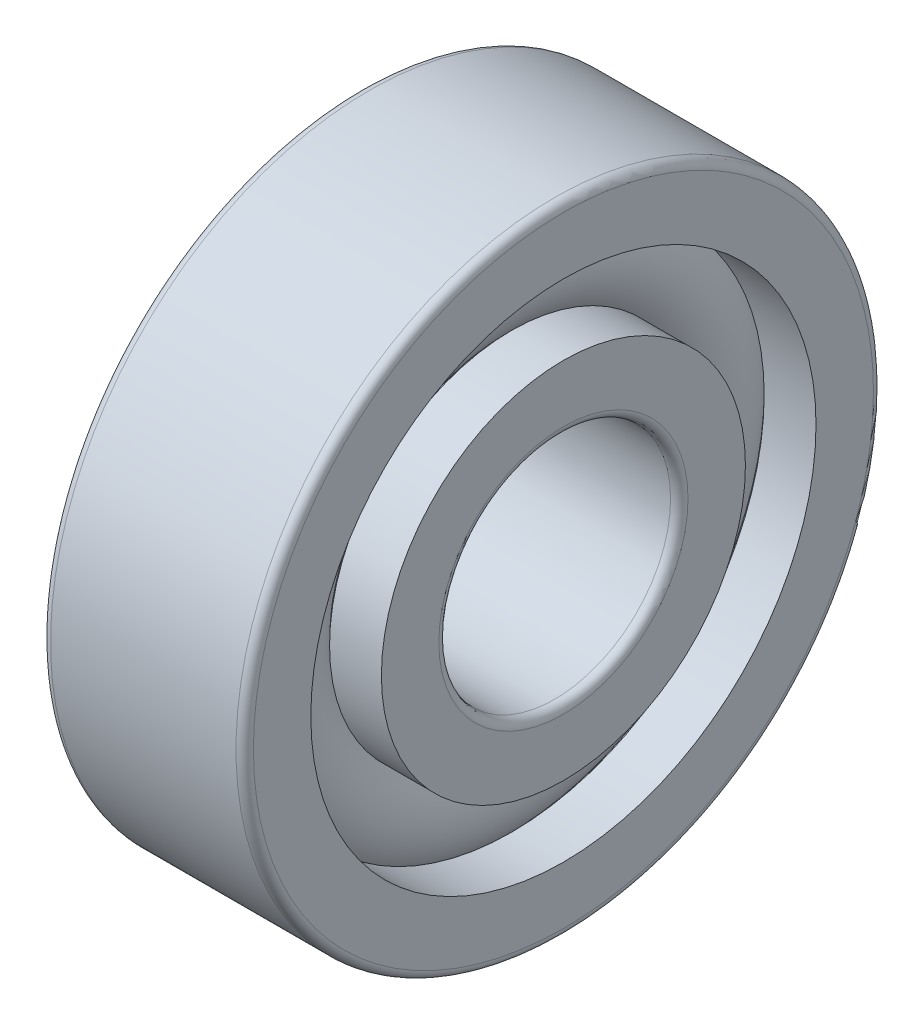
ISO-10303-21;
HEADER;
FILE_DESCRIPTION(('STEP AP214'),'2;1');
FILE_NAME('part.step','',(''),(''),'','','');
FILE_SCHEMA(('AUTOMOTIVE_DESIGN { 1 0 10303 214 1 1 1 1 }'));
ENDSEC;
DATA;
#1=APPLICATION_CONTEXT('core data for automotive mechanical design processes');
#2=APPLICATION_PROTOCOL_DEFINITION('international standard','automotive_design',2000,#1);
#3=PRODUCT_CONTEXT('',#1,'mechanical');
#4=PRODUCT('Part','Part','',(#3));
#5=PRODUCT_RELATED_PRODUCT_CATEGORY('part','',(#4));
#6=PRODUCT_DEFINITION_FORMATION('','',#4);
#7=PRODUCT_DEFINITION_CONTEXT('part definition',#1,'design');
#8=PRODUCT_DEFINITION('design','',#6,#7);
#9=PRODUCT_DEFINITION_SHAPE('','',#8);
#10=(LENGTH_UNIT() NAMED_UNIT(*) SI_UNIT(.MILLI.,.METRE.));
#11=(NAMED_UNIT(*) PLANE_ANGLE_UNIT() SI_UNIT($,.RADIAN.));
#12=(NAMED_UNIT(*) SI_UNIT($,.STERADIAN.) SOLID_ANGLE_UNIT());
#13=UNCERTAINTY_MEASURE_WITH_UNIT(LENGTH_MEASURE(1.E-05),#10,'distance_accuracy_value','');
#14=(GEOMETRIC_REPRESENTATION_CONTEXT(3) GLOBAL_UNCERTAINTY_ASSIGNED_CONTEXT((#13)) GLOBAL_UNIT_ASSIGNED_CONTEXT((#10,
#11,#12)) REPRESENTATION_CONTEXT('',''));
#15=CARTESIAN_POINT('',(0.,0.,0.));
#16=DIRECTION('',(0.,0.,1.));
#17=DIRECTION('',(1.,0.,0.));
#18=AXIS2_PLACEMENT_3D('',#15,#16,#17);
#19=CARTESIAN_POINT('',(3.5,0.,0.));
#20=DIRECTION('',(1.,0.,0.));
#21=DIRECTION('',(0.,0.,-1.));
#22=AXIS2_PLACEMENT_3D('',#19,#20,#21);
#23=TOROIDAL_SURFACE('',#22,7.5,2.079);
#24=CARTESIAN_POINT('',(3.5,0.,-9.579));
#25=VERTEX_POINT('',#24);
#26=VERTEX_LOOP('',#25);
#27=FACE_BOUND('',#26,.T.);
#28=ADVANCED_FACE('P0_F14',(#27),#23,.T.);
#29=CLOSED_SHELL('',(#28));
#30=CARTESIAN_POINT('',(3.5,0.,0.));
#31=DIRECTION('',(1.,0.,0.));
#32=DIRECTION('',(0.,0.,-1.));
#33=AXIS2_PLACEMENT_3D('',#30,#31,#32);
#34=TOROIDAL_SURFACE('',#33,7.5,2.03742);
#35=CARTESIAN_POINT('',(3.5,0.,-9.53742));
#36=VERTEX_POINT('',#35);
#37=VERTEX_LOOP('',#36);
#38=FACE_BOUND('',#37,.T.);
#39=ADVANCED_FACE('P0_F16',(#38),#34,.F.);
#40=CLOSED_SHELL('',(#39));
#41=ORIENTED_CLOSED_SHELL('',*,#40,.T.);
#42=BREP_WITH_VOIDS('P0_B1',#29,(#41));
#43=CARTESIAN_POINT('',(3.5,0.,0.));
#44=DIRECTION('',(-1.,0.,0.));
#45=DIRECTION('',(0.,0.,1.));
#46=AXIS2_PLACEMENT_3D('',#43,#44,#45);
#47=TOROIDAL_SURFACE('',#46,7.49999999999999,2.10000000000001);
#48=CARTESIAN_POINT('',(1.789305404229,0.,0.));
#49=DIRECTION('',(-1.,0.,0.));
#50=DIRECTION('',(0.,0.,1.));
#51=AXIS2_PLACEMENT_3D('',#48,#49,#50);
#52=CIRCLE('',#51,8.718);
#53=CARTESIAN_POINT('',(1.789305404229,0.,8.718));
#54=VERTEX_POINT('',#53);
#55=EDGE_CURVE('P1_E66',#54,#54,#52,.T.);
#56=ORIENTED_EDGE('',*,*,#55,.T.);
#57=EDGE_LOOP('',(#56));
#58=FACE_BOUND('',#57,.T.);
#59=CARTESIAN_POINT('',(5.210694595771,0.,0.));
#60=DIRECTION('',(-1.,0.,0.));
#61=DIRECTION('',(0.,0.,1.));
#62=AXIS2_PLACEMENT_3D('',#59,#60,#61);
#63=CIRCLE('',#62,8.718);
#64=CARTESIAN_POINT('',(5.210694595771,0.,8.718));
#65=VERTEX_POINT('',#64);
#66=EDGE_CURVE('P1_E62',#65,#65,#63,.F.);
#67=ORIENTED_EDGE('',*,*,#66,.T.);
#68=EDGE_LOOP('',(#67));
#69=FACE_BOUND('',#68,.T.);
#70=ADVANCED_FACE('P1_F17',(#58,#69),#47,.F.);
#71=CARTESIAN_POINT('',(7.35,0.,0.));
#72=DIRECTION('',(-1.,0.,0.));
#73=DIRECTION('',(0.,0.,1.));
#74=AXIS2_PLACEMENT_3D('',#71,#72,#73);
#75=CYLINDRICAL_SURFACE('',#74,8.718);
#76=ORIENTED_EDGE('',*,*,#55,.F.);
#77=EDGE_LOOP('',(#76));
#78=FACE_BOUND('',#77,.T.);
#79=CARTESIAN_POINT('',(0.,0.,0.));
#80=DIRECTION('',(-1.,0.,0.));
#81=DIRECTION('',(0.,0.,1.));
#82=AXIS2_PLACEMENT_3D('',#79,#80,#81);
#83=CIRCLE('',#82,8.718);
#84=CARTESIAN_POINT('',(0.,0.,8.718));
#85=VERTEX_POINT('',#84);
#86=EDGE_CURVE('P1_E22',#85,#85,#83,.T.);
#87=ORIENTED_EDGE('',*,*,#86,.T.);
#88=EDGE_LOOP('',(#87));
#89=FACE_BOUND('',#88,.T.);
#90=ADVANCED_FACE('P1_F107',(#78,#89),#75,.F.);
#91=CARTESIAN_POINT('',(7.35,0.,0.));
#92=DIRECTION('',(-1.,0.,0.));
#93=DIRECTION('',(0.,0.,1.));
#94=AXIS2_PLACEMENT_3D('',#91,#92,#93);
#95=CYLINDRICAL_SURFACE('',#94,8.718);
#96=ORIENTED_EDGE('',*,*,#66,.F.);
#97=EDGE_LOOP('',(#96));
#98=FACE_BOUND('',#97,.T.);
#99=CARTESIAN_POINT('',(7.,0.,0.));
#100=DIRECTION('',(-1.,0.,0.));
#101=DIRECTION('',(0.,0.,1.));
#102=AXIS2_PLACEMENT_3D('',#99,#100,#101);
#103=CIRCLE('',#102,8.718);
#104=CARTESIAN_POINT('',(7.,0.,8.718));
#105=VERTEX_POINT('',#104);
#106=EDGE_CURVE('P1_E50',#105,#105,#103,.T.);
#107=ORIENTED_EDGE('',*,*,#106,.F.);
#108=EDGE_LOOP('',(#107));
#109=FACE_BOUND('',#108,.T.);
#110=ADVANCED_FACE('P1_F105',(#98,#109),#95,.F.);
#111=CARTESIAN_POINT('',(0.,0.,0.));
#112=DIRECTION('',(1.,0.,0.));
#113=DIRECTION('',(0.,0.,-1.));
#114=AXIS2_PLACEMENT_3D('',#111,#112,#113);
#115=PLANE('',#114);
#116=CARTESIAN_POINT('',(0.,0.,0.));
#117=DIRECTION('',(1.,0.,0.));
#118=DIRECTION('',(0.,0.,-1.));
#119=AXIS2_PLACEMENT_3D('',#116,#117,#118);
#120=CIRCLE('',#119,10.7);
#121=CARTESIAN_POINT('',(0.,10.7,0.));
#122=VERTEX_POINT('',#121);
#123=CARTESIAN_POINT('',(0.,-10.7,0.));
#124=VERTEX_POINT('',#123);
#125=EDGE_CURVE('P1_E49',#122,#124,#120,.T.);
#126=ORIENTED_EDGE('',*,*,#125,.F.);
#127=CARTESIAN_POINT('',(0.,-10.7,0.));
#128=CARTESIAN_POINT('',(4.28441808046526E-08,-10.7000206018002,-0.155731176972266));
#129=CARTESIAN_POINT('',(1.87142527797702E-08,-10.6966262554764,-0.311448028479002));
#130=CARTESIAN_POINT('',(-1.0594548809439E-08,-10.6830796687314,-0.62257498520896));
#131=CARTESIAN_POINT('',(-1.57749952226646E-08,-10.6729279892665,-0.77798511482054));
#132=CARTESIAN_POINT('',(1.65838766574135E-07,-10.6425671899318,-1.12700464790973));
#133=CARTESIAN_POINT('',(4.00919694880424E-07,-10.6204789767699,-1.32045697080125));
#134=CARTESIAN_POINT('',(4.7297387966872E-07,-10.5823698603869,-1.58763922626179));
#135=CARTESIAN_POINT('',(4.65667907296704E-07,-10.5709329936371,-1.66204753314343));
#136=CARTESIAN_POINT('',(3.81191217555367E-07,-10.5299190216942,-1.91111049487476));
#137=CARTESIAN_POINT('',(2.22867376829379E-07,-10.4967347334802,-2.08518492880584));
#138=CARTESIAN_POINT('',(2.5371208492992E-08,-10.4168431729079,-2.45421840747267));
#139=CARTESIAN_POINT('',(4.57442003013319E-09,-10.3689323749512,-2.64891838191987));
#140=CARTESIAN_POINT('',(-2.99117349499777E-10,-10.3014869539373,-2.89351191082808));
#141=CARTESIAN_POINT('',(-1.23401851757406E-10,-10.2869325265207,-2.94481077879291));
#142=CARTESIAN_POINT('',(2.28383579196267E-10,-10.2443639354108,-3.09073739233532));
#143=CARTESIAN_POINT('',(2.77582641951076E-10,-10.2154328061479,-3.18509922270567));
#144=CARTESIAN_POINT('',(9.6209794425469E-10,-10.1247297847092,-3.46692231983001));
#145=CARTESIAN_POINT('',(2.13424093035944E-09,-10.0590435725525,-3.65313910283581));
#146=CARTESIAN_POINT('',(4.18786867869721E-09,-9.91747780198171,-4.02164569479922));
#147=CARTESIAN_POINT('',(5.06935288904928E-09,-9.84159822421365,-4.20393549629995));
#148=CARTESIAN_POINT('',(6.16994990779825E-09,-9.67986653455491,-4.56403942561848));
#149=CARTESIAN_POINT('',(6.38906217720119E-09,-9.59401441454931,-4.74185354979415));
#150=CARTESIAN_POINT('',(6.00226867524165E-09,-9.41260326769843,-5.09245900211604));
#151=CARTESIAN_POINT('',(5.39636312766041E-09,-9.31704424348611,-5.26525033162464));
#152=CARTESIAN_POINT('',(3.7074729994729E-09,-9.11651384216293,-5.60527908534792));
#153=CARTESIAN_POINT('',(2.62448906589219E-09,-9.01154247781749,-5.77251651709461));
#154=CARTESIAN_POINT('',(7.75402176902388E-10,-8.79249997465785,-6.10093311456806));
#155=CARTESIAN_POINT('',(9.29844792972276E-12,-8.67842885805866,-6.26211229508327));
#156=CARTESIAN_POINT('',(-5.41962392509637E-12,-8.49097234727286,-6.5120267056825));
#157=CARTESIAN_POINT('',(2.46268533806897E-10,-8.42046424848683,-6.60293520549551));
#158=CARTESIAN_POINT('',(5.75923549512679E-10,-8.27655548806601,-6.7824369425381));
#159=CARTESIAN_POINT('',(6.53890810834709E-10,-8.20315483314759,-6.8710301851428));
#160=CARTESIAN_POINT('',(5.27541708993272E-10,-8.05353812757376,-7.04580575017888));
#161=CARTESIAN_POINT('',(3.23225668870321E-10,-7.97732208014034,-7.13198807536916));
#162=CARTESIAN_POINT('',(-3.10133483402655E-11,-7.8221543668481,-7.30185211143674));
#163=CARTESIAN_POINT('',(-1.80936323629981E-10,-7.74320270089886,-7.38553382223137));
#164=CARTESIAN_POINT('',(8.07105944282768E-10,-7.56658717515005,-7.56679147119302));
#165=CARTESIAN_POINT('',(2.20861726734696E-09,-7.46833867131716,-7.6637994000972));
#166=CARTESIAN_POINT('',(7.30451139097094E-09,-7.29674062417253,-7.82679652854347));
#167=CARTESIAN_POINT('',(1.02301675790849E-08,-7.22428941959495,-7.89373542536834));
#168=CARTESIAN_POINT('',(1.66458006045726E-08,-7.05921845538704,-8.04206384375352));
#169=CARTESIAN_POINT('',(2.00940219232187E-08,-6.96608443863842,-8.1228827178692));
#170=CARTESIAN_POINT('',(2.57321124190968E-08,-6.77707735370394,-8.28124910023368));
#171=CARTESIAN_POINT('',(2.79219801904137E-08,-6.68120428245796,-8.35879660482739));
#172=CARTESIAN_POINT('',(3.02786308253107E-08,-6.48683219980679,-8.51052840233793));
#173=CARTESIAN_POINT('',(3.04454140294875E-08,-6.38833318884369,-8.58471269582098));
#174=CARTESIAN_POINT('',(2.87413285463309E-08,-6.1888278264495,-8.72962896691505));
#175=CARTESIAN_POINT('',(2.68704628216802E-08,-6.08782147866421,-8.80036094954547));
#176=CARTESIAN_POINT('',(2.16070432045351E-08,-5.88342219666097,-8.93828747390142));
#177=CARTESIAN_POINT('',(1.82144934808465E-08,-5.78002926898202,-9.00548202531752));
#178=CARTESIAN_POINT('',(1.13442273908092E-08,-5.57098154155768,-9.13625478230249));
#179=CARTESIAN_POINT('',(7.86651136732852E-09,-5.46532675091846,-9.1998330024268));
#180=CARTESIAN_POINT('',(1.84253996238561E-09,-5.25187920799096,-9.32329082272622));
#181=CARTESIAN_POINT('',(-7.037203658108E-10,-5.14408646706003,-9.3831704425423));
#182=CARTESIAN_POINT('',(7.55485859161508E-10,-4.91849904771522,-9.50344939822193));
#183=CARTESIAN_POINT('',(5.25667259766032E-09,-4.80055189882832,-9.56356295477433));
#184=CARTESIAN_POINT('',(-4.71932937912747E-09,-4.54765146590607,-9.68662713030768));
#185=CARTESIAN_POINT('',(-2.16372887797224E-08,-4.41241418712923,-9.74899423358394));
#186=CARTESIAN_POINT('',(3.95346380274403E-08,-4.1394932084926,-9.86811952950824));
#187=CARTESIAN_POINT('',(1.17618799389252E-07,-4.00180965653835,-9.92487805990711));
#188=CARTESIAN_POINT('',(1.4185262965768E-07,-3.7995915068126,-10.0032020879936));
#189=CARTESIAN_POINT('',(1.36638636645166E-07,-3.73596362574171,-10.0271315601937));
#190=CARTESIAN_POINT('',(1.05314960998661E-07,-3.53425253691591,-10.1007879200659));
#191=CARTESIAN_POINT('',(6.19915618061382E-08,-3.39534133609991,-10.1482717917067));
#192=CARTESIAN_POINT('',(1.35169974258519E-08,-3.1301795742953,-10.2328636780714));
#193=CARTESIAN_POINT('',(4.87553603483086E-09,-3.00410865345899,-10.27053700085));
#194=CARTESIAN_POINT('',(-2.23306103426926E-10,-2.79646816088441,-10.3284625964253));
#195=CARTESIAN_POINT('',(4.49635863120921E-11,-2.71527943697002,-10.3500908477888));
#196=CARTESIAN_POINT('',(-9.12742229559626E-11,-2.46853965529237,-10.4127455696213));
#197=CARTESIAN_POINT('',(-1.47330340042728E-09,-2.30222539007775,-10.4508077410585));
#198=CARTESIAN_POINT('',(1.46830266961542E-08,-1.96797292791342,-10.5189513182928));
#199=CARTESIAN_POINT('',(3.22207045317412E-08,-1.80003478966728,-10.5490330114771));
#200=CARTESIAN_POINT('',(7.8443289729365E-08,-1.58092722262813,-10.5829086785099));
#201=CARTESIAN_POINT('',(9.07323842570242E-08,-1.53030703145438,-10.5903643409726));
#202=CARTESIAN_POINT('',(1.31216688704994E-07,-1.42896574212683,-10.6045594181134));
#203=CARTESIAN_POINT('',(1.59411770760216E-07,-1.37824464478747,-10.6112988385489));
#204=CARTESIAN_POINT('',(1.90287983013437E-07,-1.25365163147976,-10.6269074626864));
#205=CARTESIAN_POINT('',(1.75567219029717E-07,-1.17972685681932,-10.63535393116));
#206=CARTESIAN_POINT('',(1.23032866982224E-07,-0.959548137339615,-10.6581747291847));
#207=CARTESIAN_POINT('',(7.66982392883451E-08,-0.813054868855301,-10.6702982895757));
#208=CARTESIAN_POINT('',(1.98947863215445E-08,-0.530818826904349,-10.6878079063488));
#209=CARTESIAN_POINT('',(6.97300082432535E-09,-0.395103083842745,-10.6936351021162));
#210=CARTESIAN_POINT('',(-6.14716068628117E-10,-0.172902763827355,-10.6989690831685));
#211=CARTESIAN_POINT('',(-2.08720576967204E-10,-0.0864520435853254,-10.7000032489343));
#212=CARTESIAN_POINT('',(2.60114755355551E-10,0.10773945706165,-10.6999959510683));
#213=CARTESIAN_POINT('',(2.13842140104958E-10,0.215480969405964,-10.6983806947826));
#214=CARTESIAN_POINT('',(6.1838762035112E-10,0.430864935906395,-10.6918878759992));
#215=CARTESIAN_POINT('',(1.0692064354725E-09,0.538507389918882,-10.6870103087789));
#216=CARTESIAN_POINT('',(2.13044578322995E-09,0.753596345694182,-10.674008393873));
#217=CARTESIAN_POINT('',(2.74086653767381E-09,0.861042847184459,-10.6658840416753));
#218=CARTESIAN_POINT('',(4.17326123935631E-09,1.0756414818028,-10.6463929921846));
#219=CARTESIAN_POINT('',(4.99523546835203E-09,1.18279361453862,-10.6350262905734));
#220=CARTESIAN_POINT('',(6.79996081865877E-09,1.39670581961932,-10.6090617027169));
#221=CARTESIAN_POINT('',(7.7827121447896E-09,1.50346589146456,-10.5944638123553));
#222=CARTESIAN_POINT('',(9.88736417346212E-09,1.71649651821774,-10.5620499476376));
#223=CARTESIAN_POINT('',(1.10092650452133E-08,1.82276707253025,-10.5442339693682));
#224=CARTESIAN_POINT('',(1.33644009719797E-08,2.03472168693261,-10.5054002370902));
#225=CARTESIAN_POINT('',(1.45976361559328E-08,2.14040574634308,-10.4843824793735));
#226=CARTESIAN_POINT('',(1.71509063277592E-08,2.35109091995982,-10.4391643463807));
#227=CARTESIAN_POINT('',(1.847094141113E-08,2.45609203341457,-10.4149639676031));
#228=CARTESIAN_POINT('',(2.11740207059922E-08,2.66531548960273,-10.3634026749677));
#229=CARTESIAN_POINT('',(2.25570649831574E-08,2.76953783152431,-10.3360417578158));
#230=CARTESIAN_POINT('',(2.5363795411047E-08,2.97710862908959,-10.2781843504466));
#231=CARTESIAN_POINT('',(2.67874816017782E-08,3.08045708387294,-10.2476878571427));
#232=CARTESIAN_POINT('',(2.96543701601672E-08,3.28618578919038,-10.1835871228348));
#233=CARTESIAN_POINT('',(3.10975725459055E-08,3.38856603882735,-10.1499828789515));
#234=CARTESIAN_POINT('',(3.3983657741908E-08,3.59226489935056,-10.079697305039));
#235=CARTESIAN_POINT('',(3.54265405518935E-08,3.6935835093146,-10.043015972337));
#236=CARTESIAN_POINT('',(3.82934281321512E-08,3.89506662480983,-9.96660969102037));
#237=CARTESIAN_POINT('',(3.97174328871184E-08,3.99523112940533,-9.92688473993826));
#238=CARTESIAN_POINT('',(4.25292863962838E-08,4.19431462169321,-9.84442747009861));
#239=CARTESIAN_POINT('',(4.39171351232639E-08,4.29323360844792,-9.80169514907721));
#240=CARTESIAN_POINT('',(4.66406782653968E-08,4.48973578924632,-9.71326213255053));
#241=CARTESIAN_POINT('',(4.79763726443084E-08,4.58731898236175,-9.66756143498262));
#242=CARTESIAN_POINT('',(5.05808887367166E-08,4.78106051914386,-9.57323336790934));
#243=CARTESIAN_POINT('',(5.18497104076169E-08,4.87721886190292,-9.5246059965398));
#244=CARTESIAN_POINT('',(5.43070425293543E-08,5.06802294160104,-9.42446895570336));
#245=CARTESIAN_POINT('',(5.54955529336858E-08,5.16266867766419,-9.37295928456745));
#246=CARTESIAN_POINT('',(5.77801038777202E-08,5.35036116807463,-9.26710464882882));
#247=CARTESIAN_POINT('',(5.88761443692318E-08,5.44340792158858,-9.2127596827485));
#248=CARTESIAN_POINT('',(6.09648766852753E-08,5.62781753032898,-9.10128404963791));
#249=CARTESIAN_POINT('',(6.19575684619311E-08,5.71918038477534,-9.0441533813172));
#250=CARTESIAN_POINT('',(6.38300043329516E-08,5.90013881564959,-8.9271584788619));
#251=CARTESIAN_POINT('',(6.47097483815339E-08,5.98973439136112,-8.86729424361931));
#252=CARTESIAN_POINT('',(6.63479697496178E-08,6.16707649798912,-8.74488683748722));
#253=CARTESIAN_POINT('',(6.7106447026987E-08,6.25482302826315,-8.68234366566698));
#254=CARTESIAN_POINT('',(6.84950956470571E-08,6.42838696483495,-8.55463546171116));
#255=CARTESIAN_POINT('',(6.91252669526097E-08,6.51420437057418,-8.48947042881649));
#256=CARTESIAN_POINT('',(7.02515441601112E-08,6.68383173959111,-8.3565779711094));
#257=CARTESIAN_POINT('',(7.07476500310075E-08,6.76764170240383,-8.28885054570349));
#258=CARTESIAN_POINT('',(7.16013169669254E-08,6.93317769927142,-8.15089511015412));
#259=CARTESIAN_POINT('',(7.19588780078794E-08,7.01490373296428,-8.08066709957628));
#260=CARTESIAN_POINT('',(7.25322554930837E-08,7.1761972873053,-7.93777458322724));
#261=CARTESIAN_POINT('',(7.27480719209182E-08,7.25576480770347,-7.86511007717387));
#262=CARTESIAN_POINT('',(7.30360405169255E-08,7.41266872126167,-7.71741088327961));
#263=CARTESIAN_POINT('',(7.31081926767792E-08,7.4900051142925,-7.64237619530147));
#264=CARTESIAN_POINT('',(7.310819267678E-08,7.64237619530147,-7.4900051142925));
#265=CARTESIAN_POINT('',(7.3036040516927E-08,7.71741088327961,-7.41266872126167));
#266=CARTESIAN_POINT('',(7.27480719209167E-08,7.86511007717386,-7.25576480770347));
#267=CARTESIAN_POINT('',(7.25322554930782E-08,7.93777458322723,-7.1761972873053));
#268=CARTESIAN_POINT('',(7.19588780078848E-08,8.08066709957627,-7.01490373296429));
#269=CARTESIAN_POINT('',(7.16013169669456E-08,8.15089511015412,-6.93317769927143));
#270=CARTESIAN_POINT('',(7.07476500309874E-08,8.28885054570348,-6.76764170240383));
#271=CARTESIAN_POINT('',(7.02515441600363E-08,8.3565779711094,-6.68383173959111));
#272=CARTESIAN_POINT('',(6.91252669526846E-08,8.48947042881648,-6.51420437057419));
#273=CARTESIAN_POINT('',(6.84950956473368E-08,8.55463546171115,-6.42838696483496));
#274=CARTESIAN_POINT('',(6.71064470267073E-08,8.68234366566697,-6.25482302826316));
#275=CARTESIAN_POINT('',(6.6347969748574E-08,8.74488683748721,-6.16707649798913));
#276=CARTESIAN_POINT('',(6.47097483825777E-08,8.86729424361931,-5.98973439136113));
#277=CARTESIAN_POINT('',(6.38300043368473E-08,8.9271584788619,-5.9001388156496));
#278=CARTESIAN_POINT('',(6.19575684580354E-08,9.0441533813172,-5.71918038477534));
#279=CARTESIAN_POINT('',(6.09648766707366E-08,9.10128404963791,-5.62781753032899));
#280=CARTESIAN_POINT('',(5.88761443837705E-08,9.2127596827485,-5.44340792158859));
#281=CARTESIAN_POINT('',(5.77801039319795E-08,9.26710464882882,-5.35036116807463));
#282=CARTESIAN_POINT('',(5.54955529878467E-08,9.37295928456745,-5.16266867766419));
#283=CARTESIAN_POINT('',(5.43070425436963E-08,9.42446895570336,-5.06802294160105));
#284=CARTESIAN_POINT('',(5.18497103932749E-08,9.52460599653979,-4.87721886190292));
#285=CARTESIAN_POINT('',(5.05808887335093E-08,9.57323336790931,-4.78106051914386));
#286=CARTESIAN_POINT('',(4.79763726475157E-08,9.66756143498264,-4.58731898236176));
#287=CARTESIAN_POINT('',(4.66406782638839E-08,9.71326213255062,-4.48973578924633));
#288=CARTESIAN_POINT('',(4.39171351247768E-08,9.80169514907711,-4.29323360844791));
#289=CARTESIAN_POINT('',(4.25292864055427E-08,9.84442747009824,-4.19431462169317));
#290=CARTESIAN_POINT('',(3.97174328778595E-08,9.92688473993862,-3.99523112940538));
#291=CARTESIAN_POINT('',(3.82934280966286E-08,9.96660969102173,-3.89506662480999));
#292=CARTESIAN_POINT('',(3.5426540587416E-08,10.0430159723357,-3.69358350931445));
#293=CARTESIAN_POINT('',(3.39836578747393E-08,10.0796973050339,-3.59226489934998));
#294=CARTESIAN_POINT('',(3.10975724130742E-08,10.1499828789566,-3.38856603882795));
#295=CARTESIAN_POINT('',(2.96543696643649E-08,10.1835871228538,-3.2861857891926));
#296=CARTESIAN_POINT('',(2.67874820975798E-08,10.2476878571237,-3.08045708387074));
#297=CARTESIAN_POINT('',(2.53637972614219E-08,10.2781843503757,-2.97710862908137));
#298=CARTESIAN_POINT('',(2.25570631327843E-08,10.3360417578866,-2.76953783153255));
#299=CARTESIAN_POINT('',(2.1174013800304E-08,10.3634026752322,-2.66531548963346));
#300=CARTESIAN_POINT('',(1.84709483168111E-08,10.4149639673386,-2.45609203338386));
#301=CARTESIAN_POINT('',(1.71509321000996E-08,10.4391643453938,-2.3510909198452));
#302=CARTESIAN_POINT('',(1.45976103836206E-08,10.4843824803604,-2.14040574645772));
#303=CARTESIAN_POINT('',(1.33643047884538E-08,10.5054002407735,-2.03472168736043));
#304=CARTESIAN_POINT('',(1.10093612286278E-08,10.5442339656849,-1.82276707210244));
#305=CARTESIAN_POINT('',(9.88772313464474E-09,10.5620499338913,-1.71649651662111));
#306=CARTESIAN_POINT('',(7.78235318404352E-09,10.5944638261017,-1.50346589306121));
#307=CARTESIAN_POINT('',(6.79862115972797E-09,10.609061754019,-1.39670582557805));
#308=CARTESIAN_POINT('',(4.99657512557615E-09,10.6350262392714,-1.18279360857992));
#309=CARTESIAN_POINT('',(4.17826090500806E-09,10.646392800723,-1.07564145956461));
#310=CARTESIAN_POINT('',(2.73586687868084E-09,10.6658842331366,-0.861042869422646));
#311=CARTESIAN_POINT('',(2.11178681423147E-09,10.674009108416,-0.753596428688137));
#312=CARTESIAN_POINT('',(1.08786537853951E-09,10.6870095942369,-0.538507306925046));
#313=CARTESIAN_POINT('',(6.88023695659781E-10,10.6918852092942,-0.4308646261694));
#314=CARTESIAN_POINT('',(1.4420616560637E-10,10.6983833614838,-0.21548127914252));
#315=CARTESIAN_POINT('',(2.29948024144996E-13,10.7000059033255,-0.107740613013363));
#316=CARTESIAN_POINT('',(0.,10.7,0.));
#317=B_SPLINE_CURVE_WITH_KNOTS('',3,(#127,#128,#129,#130,#131,#132,#133,#134,#135,#136,#137,
#138,#139,#140,#141,#142,#143,#144,#145,#146,#147,#148,#149,#150,#151,#152,#153,#154,#155,#156,
#157,#158,#159,#160,#161,#162,#163,#164,#165,#166,#167,#168,#169,#170,#171,#172,#173,#174,#175,
#176,#177,#178,#179,#180,#181,#182,#183,#184,#185,#186,#187,#188,#189,#190,#191,#192,#193,#194,
#195,#196,#197,#198,#199,#200,#201,#202,#203,#204,#205,#206,#207,#208,#209,#210,#211,#212,#213,
#214,#215,#216,#217,#218,#219,#220,#221,#222,#223,#224,#225,#226,#227,#228,#229,#230,#231,#232,
#233,#234,#235,#236,#237,#238,#239,#240,#241,#242,#243,#244,#245,#246,#247,#248,#249,#250,#251,
#252,#253,#254,#255,#256,#257,#258,#259,#260,#261,#262,#263,#264,#265,#266,#267,#268,#269,#270,
#271,#272,#273,#274,#275,#276,#277,#278,#279,#280,#281,#282,#283,#284,#285,#286,#287,#288,#289,
#290,#291,#292,#293,#294,#295,#296,#297,#298,#299,#300,#301,#302,#303,#304,#305,#306,#307,#308,
#309,#310,#311,#312,#313,#314,#315,#316),.UNSPECIFIED.,.F.,.F.,(4,2,2,2,2,2,2,2,2,2,2,2,2,2,2,2,
2,2,2,2,2,2,2,2,2,2,2,2,2,2,2,2,2,2,2,2,2,2,2,2,2,2,2,2,2,2,2,2,2,2,2,2,2,2,2,2,2,2,2,2,2,2,2,2,
2,2,2,2,2,2,2,2,2,2,2,2,2,2,2,2,2,2,2,2,2,2,2,2,2,2,2,2,2,2,4),(0.,0.467128190266816,
0.934217606980419,1.51800562494488,1.74384181807088,2.27523664429593,2.87640854247644,
3.03637646690334,3.33243379421038,3.92449298758778,4.51655330511602,5.10861410442319,
5.70067474313739,6.2927345788867,6.88479296929921,7.22988116517918,7.57496855982647,
7.92005555956156,8.26514257070322,8.67923969169643,8.97512891757365,9.34498457767355,
9.71484065099963,10.0846966620586,10.4545521353583,10.8244065954081,11.1942595667185,
11.5641105738014,11.9611676689896,12.4078202179716,12.8544458529186,13.0583741308201,
13.4986430154732,13.8932903760364,14.1453331974768,14.6569706348937,15.1685896450807,
15.3220855229196,15.4755801668531,15.698782705772,16.1396290932993,16.5470508489084,
16.8063998627716,17.1296093646443,17.4528193344185,17.7760297533781,18.0992406028071,
18.4224518639894,18.7456635182089,19.0688755467496,19.3920879308955,19.7153006519303,
20.0385136911382,20.361727029803,20.6849406492086,21.0081545306391,21.3313686553783,
21.6545830047102,21.9777975599187,22.3010123022877,22.6242272131013,22.9474422736433,
23.2706574651977,23.5938727690485,23.9170881664795,24.2403036387747,24.5635191672181,
24.8867347330936,25.2099503176852,25.5331659022768,25.8563814681523,26.1795969965957,
26.5028124688909,26.826027866322,27.1492431701727,27.4724583617271,27.7956734222691,
28.1188883330827,28.4421030754518,28.7653176306603,29.0885319799921,29.4117461047313,
29.7349599861618,30.0581736055674,30.3813869442322,30.7045999834401,31.027812704475,
31.3510250886208,31.6742371171615,31.997448771381,32.3206600325633,32.6438708819923,
32.9670813009519,33.2902912707261,33.6135007725988),.UNSPECIFIED.);
#318=EDGE_CURVE('P1_E44',#124,#122,#317,.T.);
#319=ORIENTED_EDGE('',*,*,#318,.F.);
#320=EDGE_LOOP('',(#126,#319));
#321=FACE_BOUND('',#320,.T.);
#322=ORIENTED_EDGE('',*,*,#86,.F.);
#323=EDGE_LOOP('',(#322));
#324=FACE_BOUND('',#323,.T.);
#325=ADVANCED_FACE('P1_F52',(#321,#324),#115,.F.);
#326=CARTESIAN_POINT('',(7.,0.,0.));
#327=DIRECTION('',(1.,0.,0.));
#328=DIRECTION('',(0.,0.,-1.));
#329=AXIS2_PLACEMENT_3D('',#326,#327,#328);
#330=PLANE('',#329);
#331=CARTESIAN_POINT('',(7.,10.7,0.));
#332=CARTESIAN_POINT('',(6.99999999972549,10.7000000401248,-0.084372134798505));
#333=CARTESIAN_POINT('',(7.00000000014187,10.6990072672185,-0.168744303065392));
#334=CARTESIAN_POINT('',(6.99999999902096,10.6950371592309,-0.337437133297454));
#335=CARTESIAN_POINT('',(6.99999999748378,10.6920599370188,-0.421757797918997));
#336=CARTESIAN_POINT('',(6.99999998912123,10.6841222080076,-0.590301112895944));
#337=CARTESIAN_POINT('',(6.99999998229615,10.6791618081118,-0.674523768289148));
#338=CARTESIAN_POINT('',(6.99999994989138,10.6672632239962,-0.842825133156855));
#339=CARTESIAN_POINT('',(6.99999992431265,10.6603251405053,-0.926903849743201));
#340=CARTESIAN_POINT('',(6.99999986136537,10.6444662975783,-1.09486948734367));
#341=CARTESIAN_POINT('',(6.99999982399739,10.6355456332266,-1.17875641736099));
#342=CARTESIAN_POINT('',(6.99999965275582,10.6157605403429,-1.34629827961565));
#343=CARTESIAN_POINT('',(6.99999951888657,10.6048961992511,-1.42995322211753));
#344=CARTESIAN_POINT('',(6.99999942201436,10.5861250735181,-1.56171908652319));
#345=CARTESIAN_POINT('',(6.99999941074054,10.5789055285271,-1.60992879967061));
#346=CARTESIAN_POINT('',(6.99999943019609,10.5583042492938,-1.74120176896582));
#347=CARTESIAN_POINT('',(6.99999949735821,10.5442537396069,-1.82416075120957));
#348=CARTESIAN_POINT('',(6.99999965497338,10.5078705598917,-2.02453982291364));
#349=CARTESIAN_POINT('',(6.99999974334252,10.4845398837195,-2.14177970608265));
#350=CARTESIAN_POINT('',(6.9999998807193,10.434921668122,-2.37096858981966));
#351=CARTESIAN_POINT('',(6.99999993109577,10.4087802793793,-2.48294927267868));
#352=CARTESIAN_POINT('',(6.99999998234616,10.3603033826467,-2.67649836186461));
#353=CARTESIAN_POINT('',(6.99999999279151,10.3387911133908,-2.75827363858664));
#354=CARTESIAN_POINT('',(6.99999999975766,10.3019398541875,-2.89196601621572));
#355=CARTESIAN_POINT('',(6.99999999993638,10.287164747059,-2.9440393631797));
#356=CARTESIAN_POINT('',(7.00000000012566,10.2420475895408,-3.09862923052445));
#357=CARTESIAN_POINT('',(6.99999999980226,10.2105751332856,-3.20081876129884));
#358=CARTESIAN_POINT('',(6.99999999902287,10.1445733399933,-3.40420384130322));
#359=CARTESIAN_POINT('',(6.99999999856689,10.1100440078339,-3.50539939211897));
#360=CARTESIAN_POINT('',(6.99999999754924,10.0379715456836,-3.70671176539946));
#361=CARTESIAN_POINT('',(6.99999999698756,10.0004284195399,-3.80682858924103));
#362=CARTESIAN_POINT('',(6.99999999593408,9.92235883497034,-4.00589202775733));
#363=CARTESIAN_POINT('',(6.99999999544227,9.88183237940078,-4.10483864355231));
#364=CARTESIAN_POINT('',(6.99999999461501,9.79783338210671,-4.30147329858567));
#365=CARTESIAN_POINT('',(6.99999999427955,9.75436084226258,-4.39916133862731));
#366=CARTESIAN_POINT('',(6.99999999382608,9.66450846501064,-4.59319105080668));
#367=CARTESIAN_POINT('',(6.99999999370807,9.61812862853063,-4.68953272337408));
#368=CARTESIAN_POINT('',(6.99999999370817,9.52250334795214,-4.88078326486731));
#369=CARTESIAN_POINT('',(6.99999999382627,9.47325790385365,-4.97569213379314));
#370=CARTESIAN_POINT('',(6.99999999427936,9.37194559205748,-5.16399187836505));
#371=CARTESIAN_POINT('',(6.99999999461435,9.31987872345941,-5.2573827535267));
#372=CARTESIAN_POINT('',(6.99999999544293,9.21297028715543,-5.44256269039649));
#373=CARTESIAN_POINT('',(6.99999999593651,9.15812871767856,-5.53435175108222));
#374=CARTESIAN_POINT('',(6.99999999698513,9.04572012862644,-5.71624568232702));
#375=CARTESIAN_POINT('',(6.99999999754017,8.98815310644192,-5.80635055127357));
#376=CARTESIAN_POINT('',(6.99999999857595,8.87034515168236,-5.98479519702892));
#377=CARTESIAN_POINT('',(6.99999999905669,8.81010421569411,-6.0731349715844));
#378=CARTESIAN_POINT('',(6.99999999976844,8.68700295035949,-6.24797024547978));
#379=CARTESIAN_POINT('',(6.99999999999945,8.62414261683365,-6.33446574187666));
#380=CARTESIAN_POINT('',(7.00000000000057,8.492911361178,-6.50946278205373));
#381=CARTESIAN_POINT('',(6.99999999974902,8.42441994546782,-6.59787400020895));
#382=CARTESIAN_POINT('',(6.99999999899237,8.28263485154299,-6.77508357819164));
#383=CARTESIAN_POINT('',(6.99999999848,8.20925908763934,-6.86381626862584));
#384=CARTESIAN_POINT('',(6.99999999738015,8.05753583691455,-7.04137738059293));
#385=CARTESIAN_POINT('',(6.99999999679093,7.97910611304284,-7.13013554351855));
#386=CARTESIAN_POINT('',(6.99999999567722,7.81711479320666,-7.30743644699086));
#387=CARTESIAN_POINT('',(6.99999999515499,7.73347108114974,-7.39590417342373));
#388=CARTESIAN_POINT('',(6.99999999427503,7.56090321608792,-7.57229364865636));
#389=CARTESIAN_POINT('',(6.99999999392216,7.47189737225799,-7.66013548886987));
#390=CARTESIAN_POINT('',(6.9999999934409,7.28847002114426,-7.83492294510527));
#391=CARTESIAN_POINT('',(6.99999999331868,7.19396756708724,-7.92178362616578));
#392=CARTESIAN_POINT('',(6.99999999331858,6.99942715241137,-8.09423888380231));
#393=CARTESIAN_POINT('',(6.99999999344706,6.89930932733448,-8.17974338222575));
#394=CARTESIAN_POINT('',(6.99999999392823,6.69343575601591,-8.34909686751833));
#395=CARTESIAN_POINT('',(6.99999999428646,6.5876015833287,-8.43285053066166));
#396=CARTESIAN_POINT('',(6.99999999516596,6.37021257365453,-8.59829383390344));
#397=CARTESIAN_POINT('',(6.99999999569101,6.25858112397132,-8.67988282270699));
#398=CARTESIAN_POINT('',(6.99999999680561,6.02953641952104,-8.84056920780314));
#399=CARTESIAN_POINT('',(6.99999999739639,5.91204875173072,-8.91956055220897));
#400=CARTESIAN_POINT('',(6.99999999849194,5.67125554933259,-9.07460736489453));
#401=CARTESIAN_POINT('',(6.99999999899437,5.5478782323504,-9.15055136918961));
#402=CARTESIAN_POINT('',(6.99999999976674,5.29529255662456,-9.29903690337767));
#403=CARTESIAN_POINT('',(7.00000000003111,5.16601538782143,-9.37146141909922));
#404=CARTESIAN_POINT('',(6.99999999996988,4.90872419977198,-9.50867756149603));
#405=CARTESIAN_POINT('',(6.99999999966275,4.78080044558362,-9.57363854605075));
#406=CARTESIAN_POINT('',(6.99999999923078,4.52246089123734,-9.69838490877061));
#407=CARTESIAN_POINT('',(6.99999999910592,4.39204520317192,-9.75817051906919));
#408=CARTESIAN_POINT('',(6.9999999581072,4.12893495131427,-9.87248396402418));
#409=CARTESIAN_POINT('',(6.99999991723487,3.99624047354028,-9.92701199662845));
#410=CARTESIAN_POINT('',(6.99999981158094,3.72878416841341,-10.0306534521552));
#411=CARTESIAN_POINT('',(6.99999974680424,3.59402276913315,-10.0797679794503));
#412=CARTESIAN_POINT('',(6.99999973635278,3.32263408933807,-10.1724804135142));
#413=CARTESIAN_POINT('',(6.99999979066226,3.18600705831838,-10.2160790500833));
#414=CARTESIAN_POINT('',(6.99999991194324,2.91109249097937,-10.2975979942865));
#415=CARTESIAN_POINT('',(6.99999997891282,2.77280520896608,-10.3355191598672));
#416=CARTESIAN_POINT('',(7.00000001582833,2.52954156955075,-10.3972284204107));
#417=CARTESIAN_POINT('',(7.00000000580556,2.42485849412909,-10.4221826590155));
#418=CARTESIAN_POINT('',(6.99999998510325,2.2078959422292,-10.4704488207641));
#419=CARTESIAN_POINT('',(6.99999997442373,2.09556831430972,-10.4935458745955));
#420=CARTESIAN_POINT('',(6.9999999367362,1.90095690080624,-10.530315294117));
#421=CARTESIAN_POINT('',(6.99999991497441,1.81883238546477,-10.5448402599002));
#422=CARTESIAN_POINT('',(6.99999986253295,1.60041905897413,-10.5808273581304));
#423=CARTESIAN_POINT('',(6.99999983533493,1.46384930310831,-10.6006100926121));
#424=CARTESIAN_POINT('',(6.99999981900803,1.18026143146695,-10.6360642551379));
#425=CARTESIAN_POINT('',(6.99999983273849,1.03319408230485,-10.6513408614565));
#426=CARTESIAN_POINT('',(6.99999988034174,0.738560477244121,-10.6757780259425));
#427=CARTESIAN_POINT('',(6.9999999142133,0.590994252341211,-10.6849389573114));
#428=CARTESIAN_POINT('',(6.99999997029902,0.29561676304199,-10.6970594121199));
#429=CARTESIAN_POINT('',(6.99999999251398,0.147805516089414,-10.700019359521));
#430=CARTESIAN_POINT('',(7.00000000566658,-0.111882159483177,-10.6999853457092));
#431=CARTESIAN_POINT('',(7.00000000289376,-0.223761035289324,-10.6982636044706));
#432=CARTESIAN_POINT('',(6.99999998720535,-0.445920691146937,-10.6913646737609));
#433=CARTESIAN_POINT('',(6.99999997442569,-0.556202865638732,-10.6862339234058));
#434=CARTESIAN_POINT('',(6.99999993649957,-0.74962217135655,-10.674232969125));
#435=CARTESIAN_POINT('',(6.99999991513911,-0.832805952408924,-10.6680944010858));
#436=CARTESIAN_POINT('',(6.99999986328283,-1.05335731602366,-10.649209673268));
#437=CARTESIAN_POINT('',(6.9999998359481,-1.19058375352937,-10.6347676684621));
#438=CARTESIAN_POINT('',(6.99999981949766,-1.47416231287957,-10.5993262283072));
#439=CARTESIAN_POINT('',(6.9999998332562,-1.62046492323747,-10.5779315702275));
#440=CARTESIAN_POINT('',(6.99999988072187,-1.91204811145261,-10.5290915877454));
#441=CARTESIAN_POINT('',(6.99999991442778,-2.05732875096009,-10.5016466316132));
#442=CARTESIAN_POINT('',(6.99999997044056,-2.34660147345301,-10.4406862700076));
#443=CARTESIAN_POINT('',(6.99999999274819,-2.49059364362134,-10.4071712785664));
#444=CARTESIAN_POINT('',(7.00000000530044,-2.73855117435314,-10.3441625265997));
#445=CARTESIAN_POINT('',(7.00000000255756,-2.84286104427387,-10.3160134622934));
#446=CARTESIAN_POINT('',(6.99999999008067,-3.05011505231088,-10.2567077302424));
#447=CARTESIAN_POINT('',(6.99999998037837,-3.15306323583544,-10.2255652581949));
#448=CARTESIAN_POINT('',(6.99999995090909,-3.33268953570935,-10.1682575151829));
#449=CARTESIAN_POINT('',(6.99999993421615,-3.40958198474716,-10.1427601401823));
#450=CARTESIAN_POINT('',(6.99999989358483,-3.61262430506492,-10.0728494108357));
#451=CARTESIAN_POINT('',(6.99999987200285,-3.73825820428321,-10.0269262912595));
#452=CARTESIAN_POINT('',(6.99999985903335,-3.9967026733872,-9.92689008810208));
#453=CARTESIAN_POINT('',(6.99999986993697,-4.12937694678592,-9.87242514411193));
#454=CARTESIAN_POINT('',(6.99999990606839,-4.39241601465623,-9.75819468251463));
#455=CARTESIAN_POINT('',(6.99999993129546,-4.52278092675108,-9.69842943580571));
#456=CARTESIAN_POINT('',(6.99999997837135,-4.78097922964577,-9.5736783523207));
#457=CARTESIAN_POINT('',(7.00000000022036,-4.90881276582614,-9.50869281644351));
#458=CARTESIAN_POINT('',(6.99999999979201,-5.15467834952847,-9.37744860103807));
#459=CARTESIAN_POINT('',(6.99999997992188,-5.27285788712528,-9.31146597066725));
#460=CARTESIAN_POINT('',(6.99999998639348,-5.50664260380543,-9.17511738902171));
#461=CARTESIAN_POINT('',(7.00000001273045,-5.62224804776216,-9.1047518915986));
#462=CARTESIAN_POINT('',(6.9999999851503,-5.85076749123679,-8.95979225402732));
#463=CARTESIAN_POINT('',(6.99999993124016,-5.96368172342519,-8.88519848133505));
#464=CARTESIAN_POINT('',(6.9999999028421,-6.15777849751177,-8.75141961214524));
#465=CARTESIAN_POINT('',(6.99999991146763,-6.23963995732108,-8.69321723184475));
#466=CARTESIAN_POINT('',(6.99999993753676,-6.40307229945444,-8.57351509448477));
#467=CARTESIAN_POINT('',(6.99999995512828,-6.48461439940897,-8.51197602366604));
#468=CARTESIAN_POINT('',(6.9999999802147,-6.63984393250913,-8.39129493094275));
#469=CARTESIAN_POINT('',(6.99999998836865,-6.71366135755751,-8.33231996433888));
#470=CARTESIAN_POINT('',(6.99999999863486,-6.87072309244681,-8.2034001692304));
#471=CARTESIAN_POINT('',(6.99999999965075,-6.95371050898359,-8.13314211422212));
#472=CARTESIAN_POINT('',(7.00000000040054,-7.1295487052638,-7.97964738626446));
#473=CARTESIAN_POINT('',(6.99999999992431,-7.22205857692851,-7.89601976808912));
#474=CARTESIAN_POINT('',(6.99999999929134,-7.40409454471018,-7.72557847874176));
#475=CARTESIAN_POINT('',(6.99999999913461,-7.4936206442507,-7.63876481122562));
#476=CARTESIAN_POINT('',(6.99999999885745,-7.66958676655203,-7.46206430821739));
#477=CARTESIAN_POINT('',(6.99999999873703,-7.75602679108336,-7.37217747448845));
#478=CARTESIAN_POINT('',(6.99999999872167,-7.92571346273231,-7.18943847548324));
#479=CARTESIAN_POINT('',(6.99999999882673,-8.00896010984994,-7.09658631020698));
#480=CARTESIAN_POINT('',(6.99999999916533,-8.17215879307834,-6.90803043310026));
#481=CARTESIAN_POINT('',(6.99999999939886,-8.25211082729891,-6.81232671963386));
#482=CARTESIAN_POINT('',(6.99999999981679,-8.40862313470506,-6.61818446834607));
#483=CARTESIAN_POINT('',(7.00000000000119,-8.48518340399871,-6.51974592738679));
#484=CARTESIAN_POINT('',(6.99999999999887,-8.63175010370123,-6.32434233824733));
#485=CARTESIAN_POINT('',(6.99999999982705,-8.70189654003445,-6.22748226491885));
#486=CARTESIAN_POINT('',(6.99999999928845,-8.83758342867728,-6.03335139490652));
#487=CARTESIAN_POINT('',(6.99999999892548,-8.90318655482,-5.93612440231124));
#488=CARTESIAN_POINT('',(6.99999999814101,-9.02990420099072,-5.74149524632082));
#489=CARTESIAN_POINT('',(6.9999999977208,-9.09108155211496,-5.644133984722));
#490=CARTESIAN_POINT('',(6.99999999692673,-9.2090724514681,-5.44945871042591));
#491=CARTESIAN_POINT('',(6.9999999965521,-9.26594884879712,-5.35218278565298));
#492=CARTESIAN_POINT('',(6.99999999592466,-9.37546952476139,-5.15788824084935));
#493=CARTESIAN_POINT('',(6.99999999566951,-9.42817653097274,-5.06090497482164));
#494=CARTESIAN_POINT('',(6.99999999532639,-9.52949594185845,-4.86739340115018));
#495=CARTESIAN_POINT('',(6.99999999523504,-9.578170823268,-4.77089780102424));
#496=CARTESIAN_POINT('',(6.99999999523516,-9.67156848156148,-4.57854704648536));
#497=CARTESIAN_POINT('',(6.99999999532278,-9.7163533621707,-4.48272204298172));
#498=CARTESIAN_POINT('',(6.99999999566573,-9.8021176221504,-4.29188601056909));
#499=CARTESIAN_POINT('',(6.99999999591737,-9.84315861844041,-4.19690266915287));
#500=CARTESIAN_POINT('',(6.99999999654584,-9.92158510676455,-4.0079118370733));
#501=CARTESIAN_POINT('',(6.99999999691976,-9.95903162084005,-3.91392966518403));
#502=CARTESIAN_POINT('',(6.99999999771063,-10.030421485566,-3.72709156872146));
#503=CARTESIAN_POINT('',(6.99999999812641,-10.0644251693594,-3.63425869359546));
#504=CARTESIAN_POINT('',(6.99999999892291,-10.1290844282169,-3.44985889567539));
#505=CARTESIAN_POINT('',(6.99999999930422,-10.1597995361266,-3.35831284331239));
#506=CARTESIAN_POINT('',(6.99999999980006,-10.2180348759013,-3.17661440964581));
#507=CARTESIAN_POINT('',(6.99999999992072,-10.2456138264487,-3.08648084956727));
#508=CARTESIAN_POINT('',(7.00000000007097,-10.2956208552777,-2.91500170561399));
#509=CARTESIAN_POINT('',(7.00000000010878,-10.3182858431271,-2.83372510043602));
#510=CARTESIAN_POINT('',(6.99999999988777,-10.3616987442847,-2.67066629979258));
#511=CARTESIAN_POINT('',(6.99999999962896,-10.3824467678278,-2.58888413368831));
#512=CARTESIAN_POINT('',(6.99999999595895,-10.4220117867725,-2.42485883156333));
#513=CARTESIAN_POINT('',(6.99999999254791,-10.4408288869994,-2.34261572082214));
#514=CARTESIAN_POINT('',(6.99999996993647,-10.4765251198909,-2.17771419448411));
#515=CARTESIAN_POINT('',(6.99999995073687,-10.4934043515211,-2.09505580032073));
#516=CARTESIAN_POINT('',(6.99999990206876,-10.5252064432991,-1.92936817149419));
#517=CARTESIAN_POINT('',(6.99999987260075,-10.5401293970555,-1.84633895477172));
#518=CARTESIAN_POINT('',(6.99999972248237,-10.5680457104296,-1.67995917833429));
#519=CARTESIAN_POINT('',(6.99999960183607,-10.5810391561615,-1.5966086331307));
#520=CARTESIAN_POINT('',(6.9999995160813,-10.5997866819182,-1.4657345806221));
#521=CARTESIAN_POINT('',(6.99999950626568,-10.6062409158301,-1.41831044336883));
#522=CARTESIAN_POINT('',(6.99999952234924,-10.6231401907834,-1.28740309257273));
#523=CARTESIAN_POINT('',(6.99999958095395,-10.632902579621,-1.20383105549749));
#524=CARTESIAN_POINT('',(6.9999997176924,-10.6542282913621,-1.00040474972319));
#525=CARTESIAN_POINT('',(6.99999979335378,-10.6647537315314,-0.88044058504787));
#526=CARTESIAN_POINT('',(6.99999990748129,-10.6812313841271,-0.647505341439252));
#527=CARTESIAN_POINT('',(6.99999994792362,-10.6874220849035,-0.534551042159651));
#528=CARTESIAN_POINT('',(6.99999998790963,-10.69511828428,-0.337040949112812));
#529=CARTESIAN_POINT('',(6.99999999520115,-10.6974120539494,-0.252515218960173));
#530=CARTESIAN_POINT('',(7.00000000014498,-10.6995770992572,-0.111987385418766));
#531=CARTESIAN_POINT('',(7.00000000022113,-10.7000049039563,-0.0559934962423961));
#532=CARTESIAN_POINT('',(7.,-10.7,0.));
#533=B_SPLINE_CURVE_WITH_KNOTS('',3,(#331,#332,#333,#334,#335,#336,#337,#338,#339,#340,#341,
#342,#343,#344,#345,#346,#347,#348,#349,#350,#351,#352,#353,#354,#355,#356,#357,#358,#359,#360,
#361,#362,#363,#364,#365,#366,#367,#368,#369,#370,#371,#372,#373,#374,#375,#376,#377,#378,#379,
#380,#381,#382,#383,#384,#385,#386,#387,#388,#389,#390,#391,#392,#393,#394,#395,#396,#397,#398,
#399,#400,#401,#402,#403,#404,#405,#406,#407,#408,#409,#410,#411,#412,#413,#414,#415,#416,#417,
#418,#419,#420,#421,#422,#423,#424,#425,#426,#427,#428,#429,#430,#431,#432,#433,#434,#435,#436,
#437,#438,#439,#440,#441,#442,#443,#444,#445,#446,#447,#448,#449,#450,#451,#452,#453,#454,#455,
#456,#457,#458,#459,#460,#461,#462,#463,#464,#465,#466,#467,#468,#469,#470,#471,#472,#473,#474,
#475,#476,#477,#478,#479,#480,#481,#482,#483,#484,#485,#486,#487,#488,#489,#490,#491,#492,#493,
#494,#495,#496,#497,#498,#499,#500,#501,#502,#503,#504,#505,#506,#507,#508,#509,#510,#511,#512,
#513,#514,#515,#516,#517,#518,#519,#520,#521,#522,#523,#524,#525,#526,#527,#528,#529,#530,#531,
#532),.UNSPECIFIED.,.F.,.F.,(4,2,2,2,2,2,2,2,2,2,2,2,2,2,2,2,2,2,2,2,2,2,2,2,2,2,2,2,2,2,2,2,2,
2,2,2,2,2,2,2,2,2,2,2,2,2,2,2,2,2,2,2,2,2,2,2,2,2,2,2,2,2,2,2,2,2,2,2,2,2,2,2,2,2,2,2,2,2,2,2,2,
2,2,2,2,2,2,2,2,2,2,2,2,2,2,2,2,2,2,2,4),(0.,0.253110634469623,0.506206874053341,
0.759289472317475,1.01235918269406,1.26541675848034,1.51846295283793,1.66470071653205,
1.91709778973348,2.27564408483928,2.62055801226387,2.8742065606128,3.03658866784237,
3.35731512032112,3.67804106103689,3.99876659234228,4.3194918165899,4.64021683613232,
4.96094175332215,5.28166667051198,5.60239169005441,5.92311691430202,6.24384244560742,
6.56456838632319,6.88529483880193,7.22075201521883,7.56611560681516,7.9213854553914,
8.28656139085175,8.66164323120466,9.04663078256337,9.44152383914633,9.84632218327769,
10.2610255853877,10.6856338040131,11.1201465857975,11.5645636654918,11.9948672664601,
12.4251515568107,12.8554196406201,13.2855997852419,13.7157229536223,14.1457810585304,
14.4685886065279,14.8125556702572,15.0627344920059,15.4766079065129,15.9200571093975,
16.3634792488641,16.8068710705678,17.1424988321148,17.473645768537,17.7238567498614,
18.1376980036456,18.5811471120489,19.0245692360052,19.467961125886,19.7920417081371,
20.1146548401209,20.3576664912515,20.7588570168782,21.1889967582029,21.6191145277606,
22.0492075229762,22.4551671457361,22.8610848005097,23.2669672331589,23.5682570652929,
23.8746868886414,24.1581041590347,24.4842566035129,24.8582983694996,25.2323397062987,
25.6063808285042,25.9804219507096,26.3544632875087,26.7285050534954,27.0872160472123,
27.4390214251376,27.783921035721,28.1219147338847,28.4530023810233,28.7771838450042,
29.0944590001678,29.4048277273276,29.7082899137703,30.0048454532564,30.2944942460202,
30.57723619877,30.8303462881826,31.0834418134237,31.3365235914151,31.5895924389347,
31.8426491726163,32.0956946089484,32.239274712442,32.4916715208966,32.8528747883388,
33.1921887046259,33.4458360019421,33.6138157781329),.UNSPECIFIED.);
#534=CARTESIAN_POINT('',(7.,10.7,0.));
#535=VERTEX_POINT('',#534);
#536=CARTESIAN_POINT('',(7.,-10.7,0.));
#537=VERTEX_POINT('',#536);
#538=EDGE_CURVE('P1_E55',#535,#537,#533,.T.);
#539=ORIENTED_EDGE('',*,*,#538,.F.);
#540=CARTESIAN_POINT('',(7.,0.,0.));
#541=DIRECTION('',(1.,0.,0.));
#542=DIRECTION('',(0.,0.,-1.));
#543=AXIS2_PLACEMENT_3D('',#540,#541,#542);
#544=CIRCLE('',#543,10.7);
#545=EDGE_CURVE('P1_E36',#537,#535,#544,.F.);
#546=ORIENTED_EDGE('',*,*,#545,.F.);
#547=EDGE_LOOP('',(#539,#546));
#548=FACE_BOUND('',#547,.T.);
#549=ORIENTED_EDGE('',*,*,#106,.T.);
#550=EDGE_LOOP('',(#549));
#551=FACE_BOUND('',#550,.T.);
#552=ADVANCED_FACE('P1_F87',(#548,#551),#330,.T.);
#553=CARTESIAN_POINT('',(0.3,0.,0.));
#554=DIRECTION('',(1.,0.,0.));
#555=DIRECTION('',(0.,0.,-1.));
#556=AXIS2_PLACEMENT_3D('',#553,#554,#555);
#557=TOROIDAL_SURFACE('',#556,10.7,0.3);
#558=ORIENTED_EDGE('',*,*,#318,.T.);
#559=ORIENTED_EDGE('',*,*,#125,.T.);
#560=EDGE_LOOP('',(#558,#559));
#561=FACE_BOUND('',#560,.T.);
#562=CARTESIAN_POINT('',(0.3,0.,0.));
#563=DIRECTION('',(1.,0.,0.));
#564=DIRECTION('',(0.,0.,-1.));
#565=AXIS2_PLACEMENT_3D('',#562,#563,#564);
#566=CIRCLE('',#565,11.);
#567=CARTESIAN_POINT('',(0.3,0.,-11.));
#568=VERTEX_POINT('',#567);
#569=EDGE_CURVE('P1_E28',#568,#568,#566,.T.);
#570=ORIENTED_EDGE('',*,*,#569,.F.);
#571=EDGE_LOOP('',(#570));
#572=FACE_BOUND('',#571,.T.);
#573=ADVANCED_FACE('P1_F47',(#561,#572),#557,.T.);
#574=CARTESIAN_POINT('',(6.7,0.,0.));
#575=DIRECTION('',(1.,0.,0.));
#576=DIRECTION('',(0.,0.,-1.));
#577=AXIS2_PLACEMENT_3D('',#574,#575,#576);
#578=TOROIDAL_SURFACE('',#577,10.7,0.300000000000002);
#579=ORIENTED_EDGE('',*,*,#545,.T.);
#580=ORIENTED_EDGE('',*,*,#538,.T.);
#581=EDGE_LOOP('',(#579,#580));
#582=FACE_BOUND('',#581,.T.);
#583=CARTESIAN_POINT('',(6.7,0.,0.));
#584=DIRECTION('',(1.,0.,0.));
#585=DIRECTION('',(0.,0.,-1.));
#586=AXIS2_PLACEMENT_3D('',#583,#584,#585);
#587=CIRCLE('',#586,11.);
#588=CARTESIAN_POINT('',(6.7,0.,-11.));
#589=VERTEX_POINT('',#588);
#590=EDGE_CURVE('P1_E11',#589,#589,#587,.F.);
#591=ORIENTED_EDGE('',*,*,#590,.F.);
#592=EDGE_LOOP('',(#591));
#593=FACE_BOUND('',#592,.T.);
#594=ADVANCED_FACE('P1_F19',(#582,#593),#578,.T.);
#595=CARTESIAN_POINT('',(-0.35,0.,0.));
#596=DIRECTION('',(1.,0.,0.));
#597=DIRECTION('',(0.,0.,-1.));
#598=AXIS2_PLACEMENT_3D('',#595,#596,#597);
#599=CYLINDRICAL_SURFACE('',#598,11.);
#600=ORIENTED_EDGE('',*,*,#590,.T.);
#601=EDGE_LOOP('',(#600));
#602=FACE_BOUND('',#601,.T.);
#603=ORIENTED_EDGE('',*,*,#569,.T.);
#604=EDGE_LOOP('',(#603));
#605=FACE_BOUND('',#604,.T.);
#606=ADVANCED_FACE('P1_F93',(#602,#605),#599,.T.);
#607=CLOSED_SHELL('',(#70,#90,#110,#325,#552,#573,#594,#606));
#608=MANIFOLD_SOLID_BREP('P1_B1',#607);
#609=CARTESIAN_POINT('',(3.5,0.,0.));
#610=DIRECTION('',(-1.,0.,0.));
#611=DIRECTION('',(0.,0.,1.));
#612=AXIS2_PLACEMENT_3D('',#609,#610,#611);
#613=TOROIDAL_SURFACE('',#612,7.5,2.1);
#614=CARTESIAN_POINT('',(5.210694595771,0.,0.));
#615=DIRECTION('',(-1.,0.,0.));
#616=DIRECTION('',(0.,0.,1.));
#617=AXIS2_PLACEMENT_3D('',#614,#615,#616);
#618=CIRCLE('',#617,6.282);
#619=CARTESIAN_POINT('',(5.210694595771,0.,6.282));
#620=VERTEX_POINT('',#619);
#621=EDGE_CURVE('P2_E38',#620,#620,#618,.F.);
#622=ORIENTED_EDGE('',*,*,#621,.F.);
#623=EDGE_LOOP('',(#622));
#624=FACE_BOUND('',#623,.T.);
#625=CARTESIAN_POINT('',(1.789305404229,0.,0.));
#626=DIRECTION('',(-1.,0.,0.));
#627=DIRECTION('',(0.,0.,1.));
#628=AXIS2_PLACEMENT_3D('',#625,#626,#627);
#629=CIRCLE('',#628,6.282);
#630=CARTESIAN_POINT('',(1.789305404229,0.,6.282));
#631=VERTEX_POINT('',#630);
#632=EDGE_CURVE('P2_E34',#631,#631,#629,.T.);
#633=ORIENTED_EDGE('',*,*,#632,.F.);
#634=EDGE_LOOP('',(#633));
#635=FACE_BOUND('',#634,.T.);
#636=ADVANCED_FACE('P2_F15',(#624,#635),#613,.F.);
#637=CARTESIAN_POINT('',(7.35,0.,0.));
#638=DIRECTION('',(-1.,0.,0.));
#639=DIRECTION('',(0.,0.,1.));
#640=AXIS2_PLACEMENT_3D('',#637,#638,#639);
#641=CYLINDRICAL_SURFACE('',#640,6.282);
#642=ORIENTED_EDGE('',*,*,#621,.T.);
#643=EDGE_LOOP('',(#642));
#644=FACE_BOUND('',#643,.T.);
#645=CARTESIAN_POINT('',(7.,0.,0.));
#646=DIRECTION('',(-1.,0.,0.));
#647=DIRECTION('',(0.,0.,1.));
#648=AXIS2_PLACEMENT_3D('',#645,#646,#647);
#649=CIRCLE('',#648,6.282);
#650=CARTESIAN_POINT('',(7.,0.,6.282));
#651=VERTEX_POINT('',#650);
#652=EDGE_CURVE('P2_E37',#651,#651,#649,.F.);
#653=ORIENTED_EDGE('',*,*,#652,.F.);
#654=EDGE_LOOP('',(#653));
#655=FACE_BOUND('',#654,.T.);
#656=ADVANCED_FACE('P2_F51',(#644,#655),#641,.T.);
#657=CARTESIAN_POINT('',(7.35,0.,0.));
#658=DIRECTION('',(-1.,0.,0.));
#659=DIRECTION('',(0.,0.,1.));
#660=AXIS2_PLACEMENT_3D('',#657,#658,#659);
#661=CYLINDRICAL_SURFACE('',#660,6.282);
#662=ORIENTED_EDGE('',*,*,#632,.T.);
#663=EDGE_LOOP('',(#662));
#664=FACE_BOUND('',#663,.T.);
#665=CARTESIAN_POINT('',(0.,0.,0.));
#666=DIRECTION('',(-1.,0.,0.));
#667=DIRECTION('',(0.,0.,1.));
#668=AXIS2_PLACEMENT_3D('',#665,#666,#667);
#669=CIRCLE('',#668,6.282);
#670=CARTESIAN_POINT('',(0.,0.,6.282));
#671=VERTEX_POINT('',#670);
#672=EDGE_CURVE('P2_E43',#671,#671,#669,.F.);
#673=ORIENTED_EDGE('',*,*,#672,.T.);
#674=EDGE_LOOP('',(#673));
#675=FACE_BOUND('',#674,.T.);
#676=ADVANCED_FACE('P2_F53',(#664,#675),#661,.T.);
#677=CARTESIAN_POINT('',(7.,0.,0.));
#678=DIRECTION('',(1.,0.,0.));
#679=DIRECTION('',(0.,0.,-1.));
#680=AXIS2_PLACEMENT_3D('',#677,#678,#679);
#681=PLANE('',#680);
#682=ORIENTED_EDGE('',*,*,#652,.T.);
#683=EDGE_LOOP('',(#682));
#684=FACE_BOUND('',#683,.T.);
#685=CARTESIAN_POINT('',(7.,0.,0.));
#686=DIRECTION('',(1.,0.,0.));
#687=DIRECTION('',(0.,0.,-1.));
#688=AXIS2_PLACEMENT_3D('',#685,#686,#687);
#689=CIRCLE('',#688,4.3);
#690=CARTESIAN_POINT('',(7.,0.,-4.3));
#691=VERTEX_POINT('',#690);
#692=EDGE_CURVE('P2_E31',#691,#691,#689,.T.);
#693=ORIENTED_EDGE('',*,*,#692,.F.);
#694=EDGE_LOOP('',(#693));
#695=FACE_BOUND('',#694,.T.);
#696=ADVANCED_FACE('P2_F48',(#684,#695),#681,.T.);
#697=CARTESIAN_POINT('',(0.,0.,0.));
#698=DIRECTION('',(1.,0.,0.));
#699=DIRECTION('',(0.,0.,-1.));
#700=AXIS2_PLACEMENT_3D('',#697,#698,#699);
#701=PLANE('',#700);
#702=ORIENTED_EDGE('',*,*,#672,.F.);
#703=EDGE_LOOP('',(#702));
#704=FACE_BOUND('',#703,.T.);
#705=CARTESIAN_POINT('',(0.,0.,0.));
#706=DIRECTION('',(1.,0.,0.));
#707=DIRECTION('',(0.,0.,-1.));
#708=AXIS2_PLACEMENT_3D('',#705,#706,#707);
#709=CIRCLE('',#708,4.3);
#710=CARTESIAN_POINT('',(0.,0.,-4.3));
#711=VERTEX_POINT('',#710);
#712=EDGE_CURVE('P2_E26',#711,#711,#709,.F.);
#713=ORIENTED_EDGE('',*,*,#712,.F.);
#714=EDGE_LOOP('',(#713));
#715=FACE_BOUND('',#714,.T.);
#716=ADVANCED_FACE('P2_F75',(#704,#715),#701,.F.);
#717=CARTESIAN_POINT('',(6.7,0.,0.));
#718=DIRECTION('',(1.,0.,0.));
#719=DIRECTION('',(0.,0.,-1.));
#720=AXIS2_PLACEMENT_3D('',#717,#718,#719);
#721=TOROIDAL_SURFACE('',#720,4.3,0.299999999999999);
#722=ORIENTED_EDGE('',*,*,#692,.T.);
#723=EDGE_LOOP('',(#722));
#724=FACE_BOUND('',#723,.T.);
#725=CARTESIAN_POINT('',(6.7,0.,0.));
#726=DIRECTION('',(1.,0.,0.));
#727=DIRECTION('',(0.,0.,-1.));
#728=AXIS2_PLACEMENT_3D('',#725,#726,#727);
#729=CIRCLE('',#728,4.);
#730=CARTESIAN_POINT('',(6.7,0.,-4.));
#731=VERTEX_POINT('',#730);
#732=EDGE_CURVE('P2_E10',#731,#731,#729,.F.);
#733=ORIENTED_EDGE('',*,*,#732,.T.);
#734=EDGE_LOOP('',(#733));
#735=FACE_BOUND('',#734,.T.);
#736=ADVANCED_FACE('P2_F72',(#724,#735),#721,.T.);
#737=CARTESIAN_POINT('',(0.3,0.,0.));
#738=DIRECTION('',(1.,0.,0.));
#739=DIRECTION('',(0.,0.,-1.));
#740=AXIS2_PLACEMENT_3D('',#737,#738,#739);
#741=TOROIDAL_SURFACE('',#740,4.3,0.3);
#742=CARTESIAN_POINT('',(0.3,0.,0.));
#743=DIRECTION('',(1.,0.,0.));
#744=DIRECTION('',(0.,0.,-1.));
#745=AXIS2_PLACEMENT_3D('',#742,#743,#744);
#746=CIRCLE('',#745,4.);
#747=CARTESIAN_POINT('',(0.3,0.,-4.));
#748=VERTEX_POINT('',#747);
#749=EDGE_CURVE('P2_E22',#748,#748,#746,.T.);
#750=ORIENTED_EDGE('',*,*,#749,.T.);
#751=EDGE_LOOP('',(#750));
#752=FACE_BOUND('',#751,.T.);
#753=ORIENTED_EDGE('',*,*,#712,.T.);
#754=EDGE_LOOP('',(#753));
#755=FACE_BOUND('',#754,.T.);
#756=ADVANCED_FACE('P2_F17',(#752,#755),#741,.T.);
#757=CARTESIAN_POINT('',(-0.35,0.,0.));
#758=DIRECTION('',(1.,0.,0.));
#759=DIRECTION('',(0.,0.,-1.));
#760=AXIS2_PLACEMENT_3D('',#757,#758,#759);
#761=CYLINDRICAL_SURFACE('',#760,4.);
#762=ORIENTED_EDGE('',*,*,#732,.F.);
#763=EDGE_LOOP('',(#762));
#764=FACE_BOUND('',#763,.T.);
#765=ORIENTED_EDGE('',*,*,#749,.F.);
#766=EDGE_LOOP('',(#765));
#767=FACE_BOUND('',#766,.T.);
#768=ADVANCED_FACE('P2_F65',(#764,#767),#761,.F.);
#769=CLOSED_SHELL('',(#636,#656,#676,#696,#716,#736,#756,#768));
#770=MANIFOLD_SOLID_BREP('P2_B1',#769);
#771=ADVANCED_BREP_SHAPE_REPRESENTATION('',(#18,#42,#608,#770),#14);
#772=SHAPE_DEFINITION_REPRESENTATION(#9,#771);
ENDSEC;
END-ISO-10303-21;
